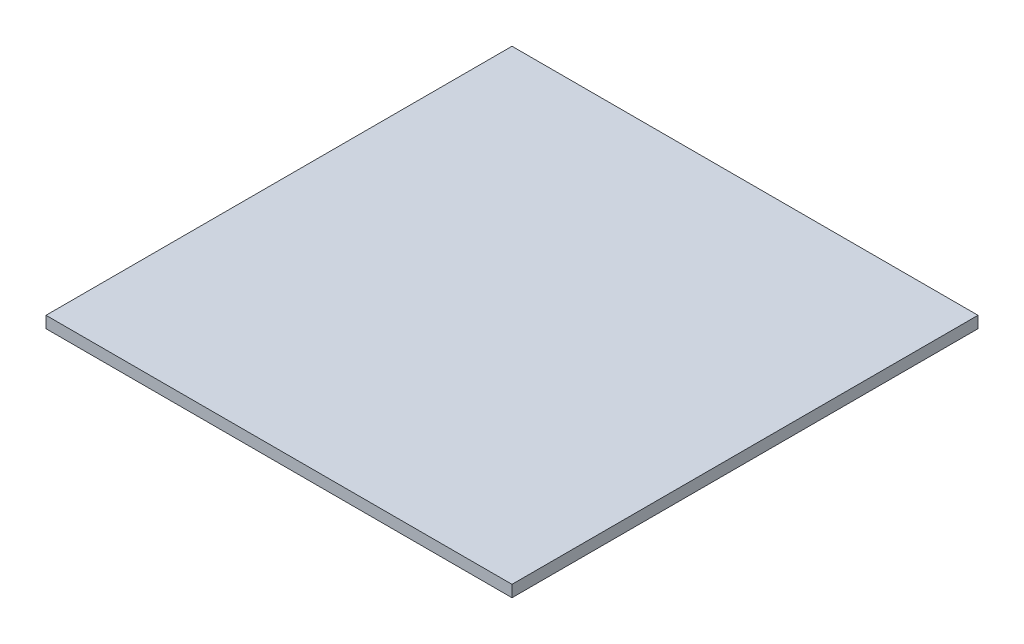
ISO-10303-21;
HEADER;
FILE_DESCRIPTION(('STEP AP214'),'2;1');
FILE_NAME('part.step','',(''),(''),'','','');
FILE_SCHEMA(('AUTOMOTIVE_DESIGN { 1 0 10303 214 1 1 1 1 }'));
ENDSEC;
DATA;
#1=APPLICATION_CONTEXT('core data for automotive mechanical design processes');
#2=APPLICATION_PROTOCOL_DEFINITION('international standard','automotive_design',2000,#1);
#3=PRODUCT_CONTEXT('',#1,'mechanical');
#4=PRODUCT('Part','Part','',(#3));
#5=PRODUCT_RELATED_PRODUCT_CATEGORY('part','',(#4));
#6=PRODUCT_DEFINITION_FORMATION('','',#4);
#7=PRODUCT_DEFINITION_CONTEXT('part definition',#1,'design');
#8=PRODUCT_DEFINITION('design','',#6,#7);
#9=PRODUCT_DEFINITION_SHAPE('','',#8);
#10=(LENGTH_UNIT() NAMED_UNIT(*) SI_UNIT(.MILLI.,.METRE.));
#11=(NAMED_UNIT(*) PLANE_ANGLE_UNIT() SI_UNIT($,.RADIAN.));
#12=(NAMED_UNIT(*) SI_UNIT($,.STERADIAN.) SOLID_ANGLE_UNIT());
#13=UNCERTAINTY_MEASURE_WITH_UNIT(LENGTH_MEASURE(1.E-05),#10,'distance_accuracy_value','');
#14=(GEOMETRIC_REPRESENTATION_CONTEXT(3) GLOBAL_UNCERTAINTY_ASSIGNED_CONTEXT((#13)) GLOBAL_UNIT_ASSIGNED_CONTEXT((#10,
#11,#12)) REPRESENTATION_CONTEXT('',''));
#15=CARTESIAN_POINT('',(0.,0.,0.));
#16=DIRECTION('',(0.,0.,1.));
#17=DIRECTION('',(1.,0.,0.));
#18=AXIS2_PLACEMENT_3D('',#15,#16,#17);
#19=CARTESIAN_POINT('',(-200.,10.,200.));
#20=DIRECTION('',(1.,0.,0.));
#21=DIRECTION('',(0.,0.,-1.));
#22=AXIS2_PLACEMENT_3D('',#19,#20,#21);
#23=PLANE('',#22);
#24=DIRECTION('',(0.,0.,1.));
#25=VECTOR('',#24,1.);
#26=CARTESIAN_POINT('',(-200.,0.,200.));
#27=LINE('',#26,#25);
#28=CARTESIAN_POINT('',(-200.,0.,-200.));
#29=VERTEX_POINT('',#28);
#30=CARTESIAN_POINT('',(-200.,0.,200.));
#31=VERTEX_POINT('',#30);
#32=EDGE_CURVE('E107',#29,#31,#27,.T.);
#33=ORIENTED_EDGE('',*,*,#32,.T.);
#34=DIRECTION('',(0.,-1.,0.));
#35=VECTOR('',#34,1.);
#36=CARTESIAN_POINT('',(-200.,10.,200.));
#37=LINE('',#36,#35);
#38=CARTESIAN_POINT('',(-200.,10.,200.));
#39=VERTEX_POINT('',#38);
#40=EDGE_CURVE('E11',#39,#31,#37,.T.);
#41=ORIENTED_EDGE('',*,*,#40,.F.);
#42=DIRECTION('',(0.,0.,1.));
#43=VECTOR('',#42,1.);
#44=CARTESIAN_POINT('',(-200.,10.,200.));
#45=LINE('',#44,#43);
#46=CARTESIAN_POINT('',(-200.,10.,-200.));
#47=VERTEX_POINT('',#46);
#48=EDGE_CURVE('E91',#47,#39,#45,.T.);
#49=ORIENTED_EDGE('',*,*,#48,.F.);
#50=DIRECTION('',(0.,-1.,0.));
#51=VECTOR('',#50,1.);
#52=CARTESIAN_POINT('',(-200.,10.,-200.));
#53=LINE('',#52,#51);
#54=EDGE_CURVE('E103',#47,#29,#53,.T.);
#55=ORIENTED_EDGE('',*,*,#54,.T.);
#56=EDGE_LOOP('',(#33,#41,#49,#55));
#57=FACE_BOUND('',#56,.T.);
#58=ADVANCED_FACE('F39',(#57),#23,.F.);
#59=CARTESIAN_POINT('',(200.,10.,200.));
#60=DIRECTION('',(0.,0.,-1.));
#61=DIRECTION('',(-1.,0.,0.));
#62=AXIS2_PLACEMENT_3D('',#59,#60,#61);
#63=PLANE('',#62);
#64=DIRECTION('',(1.,0.,0.));
#65=VECTOR('',#64,1.);
#66=CARTESIAN_POINT('',(200.,0.,200.));
#67=LINE('',#66,#65);
#68=CARTESIAN_POINT('',(200.,0.,200.));
#69=VERTEX_POINT('',#68);
#70=EDGE_CURVE('E96',#31,#69,#67,.T.);
#71=ORIENTED_EDGE('',*,*,#70,.T.);
#72=DIRECTION('',(0.,-1.,0.));
#73=VECTOR('',#72,1.);
#74=CARTESIAN_POINT('',(200.,10.,200.));
#75=LINE('',#74,#73);
#76=CARTESIAN_POINT('',(200.,10.,200.));
#77=VERTEX_POINT('',#76);
#78=EDGE_CURVE('E48',#77,#69,#75,.T.);
#79=ORIENTED_EDGE('',*,*,#78,.F.);
#80=DIRECTION('',(1.,0.,0.));
#81=VECTOR('',#80,1.);
#82=CARTESIAN_POINT('',(200.,10.,200.));
#83=LINE('',#82,#81);
#84=EDGE_CURVE('E86',#39,#77,#83,.T.);
#85=ORIENTED_EDGE('',*,*,#84,.F.);
#86=ORIENTED_EDGE('',*,*,#40,.T.);
#87=EDGE_LOOP('',(#71,#79,#85,#86));
#88=FACE_BOUND('',#87,.T.);
#89=ADVANCED_FACE('F95',(#88),#63,.F.);
#90=CARTESIAN_POINT('',(200.,10.,200.));
#91=DIRECTION('',(-1.,0.,0.));
#92=DIRECTION('',(0.,0.,1.));
#93=AXIS2_PLACEMENT_3D('',#90,#91,#92);
#94=PLANE('',#93);
#95=DIRECTION('',(0.,0.,-1.));
#96=VECTOR('',#95,1.);
#97=CARTESIAN_POINT('',(200.,0.,200.));
#98=LINE('',#97,#96);
#99=CARTESIAN_POINT('',(200.,0.,-200.));
#100=VERTEX_POINT('',#99);
#101=EDGE_CURVE('E73',#69,#100,#98,.T.);
#102=ORIENTED_EDGE('',*,*,#101,.T.);
#103=DIRECTION('',(0.,-1.,0.));
#104=VECTOR('',#103,1.);
#105=CARTESIAN_POINT('',(200.,10.,-200.));
#106=LINE('',#105,#104);
#107=CARTESIAN_POINT('',(200.,10.,-200.));
#108=VERTEX_POINT('',#107);
#109=EDGE_CURVE('E98',#108,#100,#106,.T.);
#110=ORIENTED_EDGE('',*,*,#109,.F.);
#111=DIRECTION('',(0.,0.,-1.));
#112=VECTOR('',#111,1.);
#113=CARTESIAN_POINT('',(200.,10.,200.));
#114=LINE('',#113,#112);
#115=EDGE_CURVE('E89',#77,#108,#114,.T.);
#116=ORIENTED_EDGE('',*,*,#115,.F.);
#117=ORIENTED_EDGE('',*,*,#78,.T.);
#118=EDGE_LOOP('',(#102,#110,#116,#117));
#119=FACE_BOUND('',#118,.T.);
#120=ADVANCED_FACE('F99',(#119),#94,.F.);
#121=CARTESIAN_POINT('',(200.,10.,-200.));
#122=DIRECTION('',(0.,0.,1.));
#123=DIRECTION('',(1.,0.,0.));
#124=AXIS2_PLACEMENT_3D('',#121,#122,#123);
#125=PLANE('',#124);
#126=DIRECTION('',(-1.,0.,0.));
#127=VECTOR('',#126,1.);
#128=CARTESIAN_POINT('',(200.,0.,-200.));
#129=LINE('',#128,#127);
#130=EDGE_CURVE('E79',#100,#29,#129,.T.);
#131=ORIENTED_EDGE('',*,*,#130,.T.);
#132=ORIENTED_EDGE('',*,*,#54,.F.);
#133=DIRECTION('',(-1.,0.,0.));
#134=VECTOR('',#133,1.);
#135=CARTESIAN_POINT('',(200.,10.,-200.));
#136=LINE('',#135,#134);
#137=EDGE_CURVE('E56',#108,#47,#136,.T.);
#138=ORIENTED_EDGE('',*,*,#137,.F.);
#139=ORIENTED_EDGE('',*,*,#109,.T.);
#140=EDGE_LOOP('',(#131,#132,#138,#139));
#141=FACE_BOUND('',#140,.T.);
#142=ADVANCED_FACE('F120',(#141),#125,.F.);
#143=CARTESIAN_POINT('',(0.,10.,0.));
#144=DIRECTION('',(0.,1.,0.));
#145=DIRECTION('',(0.,0.,1.));
#146=AXIS2_PLACEMENT_3D('',#143,#144,#145);
#147=PLANE('',#146);
#148=ORIENTED_EDGE('',*,*,#48,.T.);
#149=ORIENTED_EDGE('',*,*,#84,.T.);
#150=ORIENTED_EDGE('',*,*,#115,.T.);
#151=ORIENTED_EDGE('',*,*,#137,.T.);
#152=EDGE_LOOP('',(#148,#149,#150,#151));
#153=FACE_BOUND('',#152,.T.);
#154=ADVANCED_FACE('F87',(#153),#147,.T.);
#155=CARTESIAN_POINT('',(0.,0.,0.));
#156=DIRECTION('',(0.,1.,0.));
#157=DIRECTION('',(0.,0.,1.));
#158=AXIS2_PLACEMENT_3D('',#155,#156,#157);
#159=PLANE('',#158);
#160=ORIENTED_EDGE('',*,*,#32,.F.);
#161=ORIENTED_EDGE('',*,*,#130,.F.);
#162=ORIENTED_EDGE('',*,*,#101,.F.);
#163=ORIENTED_EDGE('',*,*,#70,.F.);
#164=EDGE_LOOP('',(#160,#161,#162,#163));
#165=FACE_BOUND('',#164,.T.);
#166=ADVANCED_FACE('F123',(#165),#159,.F.);
#167=CLOSED_SHELL('',(#58,#89,#120,#142,#154,#166));
#168=MANIFOLD_SOLID_BREP('B2',#167);
#169=ADVANCED_BREP_SHAPE_REPRESENTATION('',(#18,#168),#14);
#170=SHAPE_DEFINITION_REPRESENTATION(#9,#169);
ENDSEC;
END-ISO-10303-21;
